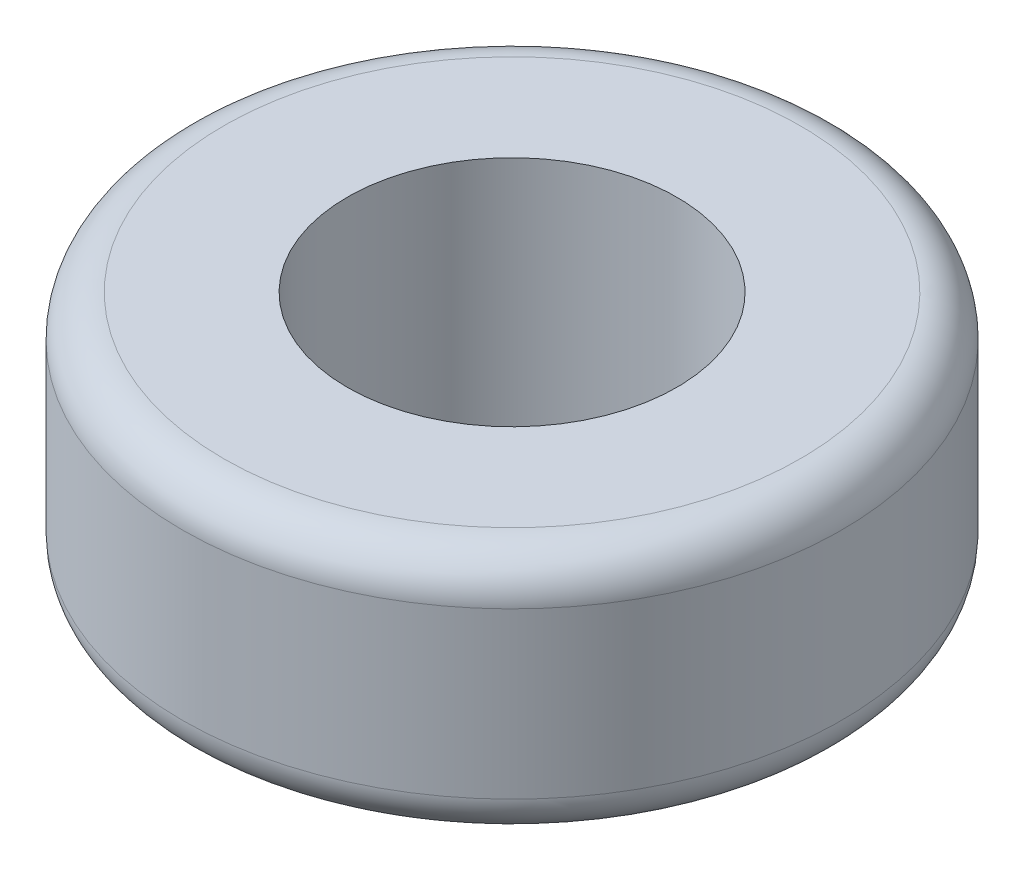
ISO-10303-21;
HEADER;
FILE_DESCRIPTION(('STEP AP214'),'2;1');
FILE_NAME('part.step','',(''),(''),'','','');
FILE_SCHEMA(('AUTOMOTIVE_DESIGN { 1 0 10303 214 1 1 1 1 }'));
ENDSEC;
DATA;
#1=APPLICATION_CONTEXT('core data for automotive mechanical design processes');
#2=APPLICATION_PROTOCOL_DEFINITION('international standard','automotive_design',2000,#1);
#3=PRODUCT_CONTEXT('',#1,'mechanical');
#4=PRODUCT('Part','Part','',(#3));
#5=PRODUCT_RELATED_PRODUCT_CATEGORY('part','',(#4));
#6=PRODUCT_DEFINITION_FORMATION('','',#4);
#7=PRODUCT_DEFINITION_CONTEXT('part definition',#1,'design');
#8=PRODUCT_DEFINITION('design','',#6,#7);
#9=PRODUCT_DEFINITION_SHAPE('','',#8);
#10=(LENGTH_UNIT() NAMED_UNIT(*) SI_UNIT(.MILLI.,.METRE.));
#11=(NAMED_UNIT(*) PLANE_ANGLE_UNIT() SI_UNIT($,.RADIAN.));
#12=(NAMED_UNIT(*) SI_UNIT($,.STERADIAN.) SOLID_ANGLE_UNIT());
#13=UNCERTAINTY_MEASURE_WITH_UNIT(LENGTH_MEASURE(1.E-05),#10,'distance_accuracy_value','');
#14=(GEOMETRIC_REPRESENTATION_CONTEXT(3) GLOBAL_UNCERTAINTY_ASSIGNED_CONTEXT((#13)) GLOBAL_UNIT_ASSIGNED_CONTEXT((#10,
#11,#12)) REPRESENTATION_CONTEXT('',''));
#15=CARTESIAN_POINT('',(0.,0.,0.));
#16=DIRECTION('',(0.,0.,1.));
#17=DIRECTION('',(1.,0.,0.));
#18=AXIS2_PLACEMENT_3D('',#15,#16,#17);
#19=CARTESIAN_POINT('',(0.,3.,0.));
#20=DIRECTION('',(0.,1.,0.));
#21=DIRECTION('',(0.,0.,1.));
#22=AXIS2_PLACEMENT_3D('',#19,#20,#21);
#23=PLANE('',#22);
#24=CARTESIAN_POINT('',(0.,3.,0.));
#25=DIRECTION('',(0.,1.,0.));
#26=DIRECTION('',(0.,0.,1.));
#27=AXIS2_PLACEMENT_3D('',#24,#25,#26);
#28=CIRCLE('',#27,3.5);
#29=CARTESIAN_POINT('',(0.,3.,3.5));
#30=VERTEX_POINT('',#29);
#31=EDGE_CURVE('E10',#30,#30,#28,.T.);
#32=ORIENTED_EDGE('',*,*,#31,.T.);
#33=EDGE_LOOP('',(#32));
#34=FACE_BOUND('',#33,.T.);
#35=CARTESIAN_POINT('',(0.,3.,0.));
#36=DIRECTION('',(0.,1.,0.));
#37=DIRECTION('',(0.,0.,1.));
#38=AXIS2_PLACEMENT_3D('',#35,#36,#37);
#39=CIRCLE('',#38,2.);
#40=CARTESIAN_POINT('',(0.,3.,2.));
#41=VERTEX_POINT('',#40);
#42=EDGE_CURVE('E61',#41,#41,#39,.T.);
#43=ORIENTED_EDGE('',*,*,#42,.F.);
#44=EDGE_LOOP('',(#43));
#45=FACE_BOUND('',#44,.T.);
#46=ADVANCED_FACE('F37',(#34,#45),#23,.T.);
#47=CARTESIAN_POINT('',(0.,0.,0.));
#48=DIRECTION('',(0.,1.,0.));
#49=DIRECTION('',(0.,0.,1.));
#50=AXIS2_PLACEMENT_3D('',#47,#48,#49);
#51=PLANE('',#50);
#52=CARTESIAN_POINT('',(0.,0.,0.));
#53=DIRECTION('',(0.,1.,0.));
#54=DIRECTION('',(0.,0.,1.));
#55=AXIS2_PLACEMENT_3D('',#52,#53,#54);
#56=CIRCLE('',#55,3.5);
#57=CARTESIAN_POINT('',(0.,0.,3.5));
#58=VERTEX_POINT('',#57);
#59=EDGE_CURVE('E45',#58,#58,#56,.F.);
#60=ORIENTED_EDGE('',*,*,#59,.T.);
#61=EDGE_LOOP('',(#60));
#62=FACE_BOUND('',#61,.T.);
#63=CARTESIAN_POINT('',(0.,0.,0.));
#64=DIRECTION('',(0.,1.,0.));
#65=DIRECTION('',(0.,0.,1.));
#66=AXIS2_PLACEMENT_3D('',#63,#64,#65);
#67=CIRCLE('',#66,2.);
#68=CARTESIAN_POINT('',(0.,0.,2.));
#69=VERTEX_POINT('',#68);
#70=EDGE_CURVE('E62',#69,#69,#67,.T.);
#71=ORIENTED_EDGE('',*,*,#70,.T.);
#72=EDGE_LOOP('',(#71));
#73=FACE_BOUND('',#72,.T.);
#74=ADVANCED_FACE('F74',(#62,#73),#51,.F.);
#75=CARTESIAN_POINT('',(0.,3.,0.));
#76=DIRECTION('',(0.,-1.,0.));
#77=DIRECTION('',(0.,0.,-1.));
#78=AXIS2_PLACEMENT_3D('',#75,#76,#77);
#79=CYLINDRICAL_SURFACE('',#78,4.);
#80=CARTESIAN_POINT('',(0.,0.5,0.));
#81=DIRECTION('',(0.,1.,0.));
#82=DIRECTION('',(0.,0.,1.));
#83=AXIS2_PLACEMENT_3D('',#80,#81,#82);
#84=CIRCLE('',#83,4.);
#85=CARTESIAN_POINT('',(0.,0.5,4.));
#86=VERTEX_POINT('',#85);
#87=EDGE_CURVE('E50',#86,#86,#84,.T.);
#88=ORIENTED_EDGE('',*,*,#87,.T.);
#89=EDGE_LOOP('',(#88));
#90=FACE_BOUND('',#89,.T.);
#91=CARTESIAN_POINT('',(0.,2.5,0.));
#92=DIRECTION('',(0.,1.,0.));
#93=DIRECTION('',(0.,0.,1.));
#94=AXIS2_PLACEMENT_3D('',#91,#92,#93);
#95=CIRCLE('',#94,4.);
#96=CARTESIAN_POINT('',(0.,2.5,4.));
#97=VERTEX_POINT('',#96);
#98=EDGE_CURVE('E55',#97,#97,#95,.F.);
#99=ORIENTED_EDGE('',*,*,#98,.T.);
#100=EDGE_LOOP('',(#99));
#101=FACE_BOUND('',#100,.T.);
#102=ADVANCED_FACE('F79',(#90,#101),#79,.T.);
#103=CARTESIAN_POINT('',(0.,3.,0.));
#104=DIRECTION('',(0.,-1.,0.));
#105=DIRECTION('',(0.,0.,-1.));
#106=AXIS2_PLACEMENT_3D('',#103,#104,#105);
#107=CYLINDRICAL_SURFACE('',#106,2.);
#108=ORIENTED_EDGE('',*,*,#42,.T.);
#109=EDGE_LOOP('',(#108));
#110=FACE_BOUND('',#109,.T.);
#111=ORIENTED_EDGE('',*,*,#70,.F.);
#112=EDGE_LOOP('',(#111));
#113=FACE_BOUND('',#112,.T.);
#114=ADVANCED_FACE('F70',(#110,#113),#107,.F.);
#115=CARTESIAN_POINT('',(0.,0.5,0.));
#116=DIRECTION('',(0.,1.,0.));
#117=DIRECTION('',(0.,0.,1.));
#118=AXIS2_PLACEMENT_3D('',#115,#116,#117);
#119=TOROIDAL_SURFACE('',#118,3.5,0.5);
#120=ORIENTED_EDGE('',*,*,#59,.F.);
#121=EDGE_LOOP('',(#120));
#122=FACE_BOUND('',#121,.T.);
#123=ORIENTED_EDGE('',*,*,#87,.F.);
#124=EDGE_LOOP('',(#123));
#125=FACE_BOUND('',#124,.T.);
#126=ADVANCED_FACE('F85',(#122,#125),#119,.T.);
#127=CARTESIAN_POINT('',(0.,2.5,0.));
#128=DIRECTION('',(0.,1.,0.));
#129=DIRECTION('',(0.,0.,1.));
#130=AXIS2_PLACEMENT_3D('',#127,#128,#129);
#131=TOROIDAL_SURFACE('',#130,3.5,0.5);
#132=ORIENTED_EDGE('',*,*,#98,.F.);
#133=EDGE_LOOP('',(#132));
#134=FACE_BOUND('',#133,.T.);
#135=ORIENTED_EDGE('',*,*,#31,.F.);
#136=EDGE_LOOP('',(#135));
#137=FACE_BOUND('',#136,.T.);
#138=ADVANCED_FACE('F39',(#134,#137),#131,.T.);
#139=CLOSED_SHELL('',(#46,#74,#102,#114,#126,#138));
#140=MANIFOLD_SOLID_BREP('B2',#139);
#141=ADVANCED_BREP_SHAPE_REPRESENTATION('',(#18,#140),#14);
#142=SHAPE_DEFINITION_REPRESENTATION(#9,#141);
ENDSEC;
END-ISO-10303-21;
